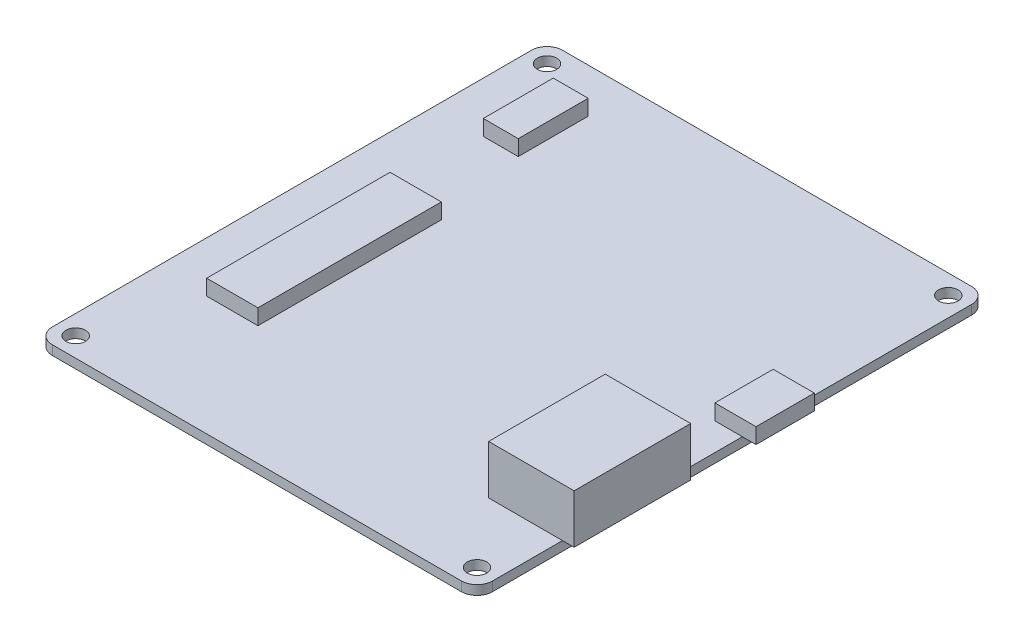
ISO-10303-21;
HEADER;
FILE_DESCRIPTION(('STEP AP214'),'2;1');
FILE_NAME('part.step','',(''),(''),'','','');
FILE_SCHEMA(('AUTOMOTIVE_DESIGN { 1 0 10303 214 1 1 1 1 }'));
ENDSEC;
DATA;
#1=APPLICATION_CONTEXT('core data for automotive mechanical design processes');
#2=APPLICATION_PROTOCOL_DEFINITION('international standard','automotive_design',2000,#1);
#3=PRODUCT_CONTEXT('',#1,'mechanical');
#4=PRODUCT('Part','Part','',(#3));
#5=PRODUCT_RELATED_PRODUCT_CATEGORY('part','',(#4));
#6=PRODUCT_DEFINITION_FORMATION('','',#4);
#7=PRODUCT_DEFINITION_CONTEXT('part definition',#1,'design');
#8=PRODUCT_DEFINITION('design','',#6,#7);
#9=PRODUCT_DEFINITION_SHAPE('','',#8);
#10=(LENGTH_UNIT() NAMED_UNIT(*) SI_UNIT(.MILLI.,.METRE.));
#11=(NAMED_UNIT(*) PLANE_ANGLE_UNIT() SI_UNIT($,.RADIAN.));
#12=(NAMED_UNIT(*) SI_UNIT($,.STERADIAN.) SOLID_ANGLE_UNIT());
#13=UNCERTAINTY_MEASURE_WITH_UNIT(LENGTH_MEASURE(1.E-05),#10,'distance_accuracy_value','');
#14=(GEOMETRIC_REPRESENTATION_CONTEXT(3) GLOBAL_UNCERTAINTY_ASSIGNED_CONTEXT((#13)) GLOBAL_UNIT_ASSIGNED_CONTEXT((#10,
#11,#12)) REPRESENTATION_CONTEXT('',''));
#15=CARTESIAN_POINT('',(0.,0.,0.));
#16=DIRECTION('',(0.,0.,1.));
#17=DIRECTION('',(1.,0.,0.));
#18=AXIS2_PLACEMENT_3D('',#15,#16,#17);
#19=CARTESIAN_POINT('',(26.32,1.2,-30.825));
#20=DIRECTION('',(0.,-1.,0.));
#21=DIRECTION('',(0.,0.,-1.));
#22=AXIS2_PLACEMENT_3D('',#19,#20,#21);
#23=PLANE('',#22);
#24=DIRECTION('',(0.,0.,1.));
#25=VECTOR('',#24,1.);
#26=CARTESIAN_POINT('',(-21.82,1.2,-6.12500000000001));
#27=LINE('',#26,#25);
#28=CARTESIAN_POINT('',(-21.82,1.2,-6.12500000000001));
#29=VERTEX_POINT('',#28);
#30=CARTESIAN_POINT('',(-21.82,1.2,17.475));
#31=VERTEX_POINT('',#30);
#32=EDGE_CURVE('E300',#29,#31,#27,.T.);
#33=ORIENTED_EDGE('',*,*,#32,.F.);
#34=DIRECTION('',(-1.,0.,0.));
#35=VECTOR('',#34,1.);
#36=CARTESIAN_POINT('',(-21.82,1.2,-6.12500000000001));
#37=LINE('',#36,#35);
#38=CARTESIAN_POINT('',(-15.22,1.2,-6.12500000000001));
#39=VERTEX_POINT('',#38);
#40=EDGE_CURVE('E305',#39,#29,#37,.T.);
#41=ORIENTED_EDGE('',*,*,#40,.F.);
#42=DIRECTION('',(0.,0.,-1.));
#43=VECTOR('',#42,1.);
#44=CARTESIAN_POINT('',(-15.22,1.2,-6.12500000000001));
#45=LINE('',#44,#43);
#46=CARTESIAN_POINT('',(-15.22,1.2,17.475));
#47=VERTEX_POINT('',#46);
#48=EDGE_CURVE('E317',#47,#39,#45,.T.);
#49=ORIENTED_EDGE('',*,*,#48,.F.);
#50=DIRECTION('',(1.,0.,0.));
#51=VECTOR('',#50,1.);
#52=CARTESIAN_POINT('',(-21.82,1.2,17.475));
#53=LINE('',#52,#51);
#54=EDGE_CURVE('E314',#31,#47,#53,.T.);
#55=ORIENTED_EDGE('',*,*,#54,.F.);
#56=EDGE_LOOP('',(#33,#41,#49,#55));
#57=FACE_BOUND('',#56,.T.);
#58=CARTESIAN_POINT('',(-25.82,1.2,-30.325));
#59=DIRECTION('',(0.,1.,0.));
#60=DIRECTION('',(0.,0.,1.));
#61=AXIS2_PLACEMENT_3D('',#58,#59,#60);
#62=CIRCLE('',#61,1.25);
#63=CARTESIAN_POINT('',(-25.82,1.2,-29.075));
#64=VERTEX_POINT('',#63);
#65=EDGE_CURVE('E333',#64,#64,#62,.T.);
#66=ORIENTED_EDGE('',*,*,#65,.F.);
#67=EDGE_LOOP('',(#66));
#68=FACE_BOUND('',#67,.T.);
#69=CARTESIAN_POINT('',(-25.82,1.2,30.325));
#70=DIRECTION('',(0.,1.,0.));
#71=DIRECTION('',(0.,0.,1.));
#72=AXIS2_PLACEMENT_3D('',#69,#70,#71);
#73=CIRCLE('',#72,1.25);
#74=CARTESIAN_POINT('',(-25.82,1.2,31.575));
#75=VERTEX_POINT('',#74);
#76=EDGE_CURVE('E339',#75,#75,#73,.T.);
#77=ORIENTED_EDGE('',*,*,#76,.F.);
#78=EDGE_LOOP('',(#77));
#79=FACE_BOUND('',#78,.T.);
#80=CARTESIAN_POINT('',(25.82,1.2,30.325));
#81=DIRECTION('',(0.,1.,0.));
#82=DIRECTION('',(0.,0.,1.));
#83=AXIS2_PLACEMENT_3D('',#80,#81,#82);
#84=CIRCLE('',#83,1.25);
#85=CARTESIAN_POINT('',(25.82,1.2,31.575));
#86=VERTEX_POINT('',#85);
#87=EDGE_CURVE('E345',#86,#86,#84,.T.);
#88=ORIENTED_EDGE('',*,*,#87,.F.);
#89=EDGE_LOOP('',(#88));
#90=FACE_BOUND('',#89,.T.);
#91=CARTESIAN_POINT('',(25.82,1.2,-30.325));
#92=DIRECTION('',(0.,1.,0.));
#93=DIRECTION('',(0.,0.,1.));
#94=AXIS2_PLACEMENT_3D('',#91,#92,#93);
#95=CIRCLE('',#94,1.25);
#96=CARTESIAN_POINT('',(25.82,1.2,-29.075));
#97=VERTEX_POINT('',#96);
#98=EDGE_CURVE('E351',#97,#97,#95,.T.);
#99=ORIENTED_EDGE('',*,*,#98,.F.);
#100=EDGE_LOOP('',(#99));
#101=FACE_BOUND('',#100,.T.);
#102=DIRECTION('',(0.,0.,1.));
#103=VECTOR('',#102,1.);
#104=CARTESIAN_POINT('',(-21.82,1.2,-27.125));
#105=LINE('',#104,#103);
#106=CARTESIAN_POINT('',(-21.82,1.2,-27.125));
#107=VERTEX_POINT('',#106);
#108=CARTESIAN_POINT('',(-21.82,1.2,-18.125));
#109=VERTEX_POINT('',#108);
#110=EDGE_CURVE('E267',#107,#109,#105,.T.);
#111=ORIENTED_EDGE('',*,*,#110,.F.);
#112=DIRECTION('',(-1.,0.,0.));
#113=VECTOR('',#112,1.);
#114=CARTESIAN_POINT('',(-21.82,1.2,-27.125));
#115=LINE('',#114,#113);
#116=CARTESIAN_POINT('',(-17.32,1.2,-27.125));
#117=VERTEX_POINT('',#116);
#118=EDGE_CURVE('E272',#117,#107,#115,.T.);
#119=ORIENTED_EDGE('',*,*,#118,.F.);
#120=DIRECTION('',(0.,0.,-1.));
#121=VECTOR('',#120,1.);
#122=CARTESIAN_POINT('',(-17.32,1.2,-27.125));
#123=LINE('',#122,#121);
#124=CARTESIAN_POINT('',(-17.32,1.2,-18.125));
#125=VERTEX_POINT('',#124);
#126=EDGE_CURVE('E284',#125,#117,#123,.T.);
#127=ORIENTED_EDGE('',*,*,#126,.F.);
#128=DIRECTION('',(1.,0.,0.));
#129=VECTOR('',#128,1.);
#130=CARTESIAN_POINT('',(-21.82,1.2,-18.125));
#131=LINE('',#130,#129);
#132=EDGE_CURVE('E281',#109,#125,#131,.T.);
#133=ORIENTED_EDGE('',*,*,#132,.F.);
#134=EDGE_LOOP('',(#111,#119,#127,#133));
#135=FACE_BOUND('',#134,.T.);
#136=DIRECTION('',(1.,0.,0.));
#137=VECTOR('',#136,1.);
#138=CARTESIAN_POINT('',(18.82,1.2,21.825));
#139=LINE('',#138,#137);
#140=CARTESIAN_POINT('',(18.82,1.2,21.825));
#141=VERTEX_POINT('',#140);
#142=CARTESIAN_POINT('',(28.32,1.2,21.825));
#143=VERTEX_POINT('',#142);
#144=EDGE_CURVE('E48',#141,#143,#139,.T.);
#145=ORIENTED_EDGE('',*,*,#144,.F.);
#146=DIRECTION('',(0.,0.,1.));
#147=VECTOR('',#146,1.);
#148=CARTESIAN_POINT('',(18.82,1.2,6.82499999999999));
#149=LINE('',#148,#147);
#150=CARTESIAN_POINT('',(18.82,1.2,6.825));
#151=VERTEX_POINT('',#150);
#152=EDGE_CURVE('E53',#151,#141,#149,.T.);
#153=ORIENTED_EDGE('',*,*,#152,.F.);
#154=DIRECTION('',(-1.,0.,0.));
#155=VECTOR('',#154,1.);
#156=CARTESIAN_POINT('',(18.82,1.2,6.82499999999999));
#157=LINE('',#156,#155);
#158=CARTESIAN_POINT('',(28.32,1.2,6.82499999999999));
#159=VERTEX_POINT('',#158);
#160=EDGE_CURVE('E839',#159,#151,#157,.T.);
#161=ORIENTED_EDGE('',*,*,#160,.F.);
#162=DIRECTION('',(0.,0.,-1.));
#163=VECTOR('',#162,1.);
#164=CARTESIAN_POINT('',(28.32,1.2,30.825));
#165=LINE('',#164,#163);
#166=CARTESIAN_POINT('',(28.32,1.2,-1.32500000000001));
#167=VERTEX_POINT('',#166);
#168=EDGE_CURVE('E379',#159,#167,#165,.T.);
#169=ORIENTED_EDGE('',*,*,#168,.T.);
#170=DIRECTION('',(1.,0.,0.));
#171=VECTOR('',#170,1.);
#172=CARTESIAN_POINT('',(24.78,1.2,-1.32500000000001));
#173=LINE('',#172,#171);
#174=CARTESIAN_POINT('',(24.78,1.2,-1.32500000000001));
#175=VERTEX_POINT('',#174);
#176=EDGE_CURVE('E248',#175,#167,#173,.T.);
#177=ORIENTED_EDGE('',*,*,#176,.F.);
#178=DIRECTION('',(0.,0.,1.));
#179=VECTOR('',#178,1.);
#180=CARTESIAN_POINT('',(24.78,1.2,-8.82500000000001));
#181=LINE('',#180,#179);
#182=CARTESIAN_POINT('',(24.78,1.2,-8.82500000000001));
#183=VERTEX_POINT('',#182);
#184=EDGE_CURVE('E228',#183,#175,#181,.T.);
#185=ORIENTED_EDGE('',*,*,#184,.F.);
#186=DIRECTION('',(-1.,0.,0.));
#187=VECTOR('',#186,1.);
#188=CARTESIAN_POINT('',(24.78,1.2,-8.82500000000001));
#189=LINE('',#188,#187);
#190=CARTESIAN_POINT('',(28.32,1.2,-8.82500000000001));
#191=VERTEX_POINT('',#190);
#192=EDGE_CURVE('E253',#191,#183,#189,.T.);
#193=ORIENTED_EDGE('',*,*,#192,.F.);
#194=CARTESIAN_POINT('',(28.32,1.2,-30.825));
#195=VERTEX_POINT('',#194);
#196=EDGE_CURVE('E374',#191,#195,#165,.T.);
#197=ORIENTED_EDGE('',*,*,#196,.T.);
#198=CARTESIAN_POINT('',(26.32,1.2,-30.825));
#199=DIRECTION('',(0.,1.,0.));
#200=DIRECTION('',(0.,0.,-1.));
#201=AXIS2_PLACEMENT_3D('',#198,#199,#200);
#202=CIRCLE('',#201,2.);
#203=CARTESIAN_POINT('',(26.32,1.2,-32.825));
#204=VERTEX_POINT('',#203);
#205=EDGE_CURVE('E358',#195,#204,#202,.T.);
#206=ORIENTED_EDGE('',*,*,#205,.T.);
#207=DIRECTION('',(-1.,0.,0.));
#208=VECTOR('',#207,1.);
#209=CARTESIAN_POINT('',(-26.32,1.2,-32.825));
#210=LINE('',#209,#208);
#211=CARTESIAN_POINT('',(-26.32,1.2,-32.825));
#212=VERTEX_POINT('',#211);
#213=EDGE_CURVE('E361',#204,#212,#210,.T.);
#214=ORIENTED_EDGE('',*,*,#213,.T.);
#215=CARTESIAN_POINT('',(-26.32,1.2,-30.825));
#216=DIRECTION('',(0.,1.,0.));
#217=DIRECTION('',(0.,0.,-1.));
#218=AXIS2_PLACEMENT_3D('',#215,#216,#217);
#219=CIRCLE('',#218,2.);
#220=CARTESIAN_POINT('',(-28.32,1.2,-30.825));
#221=VERTEX_POINT('',#220);
#222=EDGE_CURVE('E364',#212,#221,#219,.T.);
#223=ORIENTED_EDGE('',*,*,#222,.T.);
#224=DIRECTION('',(0.,0.,1.));
#225=VECTOR('',#224,1.);
#226=CARTESIAN_POINT('',(-28.32,1.2,30.825));
#227=LINE('',#226,#225);
#228=CARTESIAN_POINT('',(-28.32,1.2,30.825));
#229=VERTEX_POINT('',#228);
#230=EDGE_CURVE('E366',#221,#229,#227,.T.);
#231=ORIENTED_EDGE('',*,*,#230,.T.);
#232=CARTESIAN_POINT('',(-26.32,1.2,30.825));
#233=DIRECTION('',(0.,1.,0.));
#234=DIRECTION('',(0.,0.,-1.));
#235=AXIS2_PLACEMENT_3D('',#232,#233,#234);
#236=CIRCLE('',#235,2.);
#237=CARTESIAN_POINT('',(-26.32,1.2,32.825));
#238=VERTEX_POINT('',#237);
#239=EDGE_CURVE('E368',#229,#238,#236,.T.);
#240=ORIENTED_EDGE('',*,*,#239,.T.);
#241=DIRECTION('',(1.,0.,0.));
#242=VECTOR('',#241,1.);
#243=CARTESIAN_POINT('',(-26.32,1.2,32.825));
#244=LINE('',#243,#242);
#245=CARTESIAN_POINT('',(26.32,1.2,32.825));
#246=VERTEX_POINT('',#245);
#247=EDGE_CURVE('E370',#238,#246,#244,.T.);
#248=ORIENTED_EDGE('',*,*,#247,.T.);
#249=CARTESIAN_POINT('',(26.32,1.2,30.825));
#250=DIRECTION('',(0.,1.,0.));
#251=DIRECTION('',(0.,0.,1.));
#252=AXIS2_PLACEMENT_3D('',#249,#250,#251);
#253=CIRCLE('',#252,2.);
#254=CARTESIAN_POINT('',(28.32,1.2,30.825));
#255=VERTEX_POINT('',#254);
#256=EDGE_CURVE('E372',#246,#255,#253,.T.);
#257=ORIENTED_EDGE('',*,*,#256,.T.);
#258=EDGE_CURVE('E375',#255,#143,#165,.T.);
#259=ORIENTED_EDGE('',*,*,#258,.T.);
#260=EDGE_LOOP('',(#145,#153,#161,#169,#177,#185,#193,#197,#206,#214,#223,#231,#240,#248,#257,#259));
#261=FACE_BOUND('',#260,.T.);
#262=ADVANCED_FACE('F33',(#57,#68,#79,#90,#101,#135,#261),#23,.F.);
#263=CARTESIAN_POINT('',(26.32,1.2,-30.825));
#264=DIRECTION('',(0.,-1.,0.));
#265=DIRECTION('',(0.,0.,-1.));
#266=AXIS2_PLACEMENT_3D('',#263,#264,#265);
#267=CYLINDRICAL_SURFACE('',#266,2.);
#268=CARTESIAN_POINT('',(26.32,0.,-30.825));
#269=DIRECTION('',(0.,1.,0.));
#270=DIRECTION('',(0.,0.,-1.));
#271=AXIS2_PLACEMENT_3D('',#268,#269,#270);
#272=CIRCLE('',#271,2.);
#273=CARTESIAN_POINT('',(28.32,0.,-30.825));
#274=VERTEX_POINT('',#273);
#275=CARTESIAN_POINT('',(26.32,0.,-32.825));
#276=VERTEX_POINT('',#275);
#277=EDGE_CURVE('E357',#274,#276,#272,.T.);
#278=ORIENTED_EDGE('',*,*,#277,.T.);
#279=DIRECTION('',(0.,-1.,0.));
#280=VECTOR('',#279,1.);
#281=CARTESIAN_POINT('',(26.32,1.2,-32.825));
#282=LINE('',#281,#280);
#283=EDGE_CURVE('E11',#204,#276,#282,.T.);
#284=ORIENTED_EDGE('',*,*,#283,.F.);
#285=ORIENTED_EDGE('',*,*,#205,.F.);
#286=DIRECTION('',(0.,-1.,0.));
#287=VECTOR('',#286,1.);
#288=CARTESIAN_POINT('',(28.32,1.2,-30.825));
#289=LINE('',#288,#287);
#290=EDGE_CURVE('E377',#195,#274,#289,.T.);
#291=ORIENTED_EDGE('',*,*,#290,.T.);
#292=EDGE_LOOP('',(#278,#284,#285,#291));
#293=FACE_BOUND('',#292,.T.);
#294=ADVANCED_FACE('F35',(#293),#267,.T.);
#295=CARTESIAN_POINT('',(-26.32,1.2,-32.825));
#296=DIRECTION('',(0.,0.,1.));
#297=DIRECTION('',(1.,0.,0.));
#298=AXIS2_PLACEMENT_3D('',#295,#296,#297);
#299=PLANE('',#298);
#300=DIRECTION('',(-1.,0.,0.));
#301=VECTOR('',#300,1.);
#302=CARTESIAN_POINT('',(-26.32,0.,-32.825));
#303=LINE('',#302,#301);
#304=CARTESIAN_POINT('',(-26.32,0.,-32.825));
#305=VERTEX_POINT('',#304);
#306=EDGE_CURVE('E383',#276,#305,#303,.T.);
#307=ORIENTED_EDGE('',*,*,#306,.T.);
#308=DIRECTION('',(0.,-1.,0.));
#309=VECTOR('',#308,1.);
#310=CARTESIAN_POINT('',(-26.32,1.2,-32.825));
#311=LINE('',#310,#309);
#312=EDGE_CURVE('E41',#212,#305,#311,.T.);
#313=ORIENTED_EDGE('',*,*,#312,.F.);
#314=ORIENTED_EDGE('',*,*,#213,.F.);
#315=ORIENTED_EDGE('',*,*,#283,.T.);
#316=EDGE_LOOP('',(#307,#313,#314,#315));
#317=FACE_BOUND('',#316,.T.);
#318=ADVANCED_FACE('F438',(#317),#299,.F.);
#319=CARTESIAN_POINT('',(-26.32,1.2,-30.825));
#320=DIRECTION('',(0.,-1.,0.));
#321=DIRECTION('',(0.,0.,-1.));
#322=AXIS2_PLACEMENT_3D('',#319,#320,#321);
#323=CYLINDRICAL_SURFACE('',#322,2.);
#324=CARTESIAN_POINT('',(-26.32,0.,-30.825));
#325=DIRECTION('',(0.,1.,0.));
#326=DIRECTION('',(0.,0.,-1.));
#327=AXIS2_PLACEMENT_3D('',#324,#325,#326);
#328=CIRCLE('',#327,2.);
#329=CARTESIAN_POINT('',(-28.32,0.,-30.825));
#330=VERTEX_POINT('',#329);
#331=EDGE_CURVE('E385',#305,#330,#328,.T.);
#332=ORIENTED_EDGE('',*,*,#331,.T.);
#333=DIRECTION('',(0.,-1.,0.));
#334=VECTOR('',#333,1.);
#335=CARTESIAN_POINT('',(-28.32,1.2,-30.825));
#336=LINE('',#335,#334);
#337=EDGE_CURVE('E410',#221,#330,#336,.T.);
#338=ORIENTED_EDGE('',*,*,#337,.F.);
#339=ORIENTED_EDGE('',*,*,#222,.F.);
#340=ORIENTED_EDGE('',*,*,#312,.T.);
#341=EDGE_LOOP('',(#332,#338,#339,#340));
#342=FACE_BOUND('',#341,.T.);
#343=ADVANCED_FACE('F417',(#342),#323,.T.);
#344=CARTESIAN_POINT('',(-28.32,1.2,30.825));
#345=DIRECTION('',(1.,0.,0.));
#346=DIRECTION('',(0.,0.,-1.));
#347=AXIS2_PLACEMENT_3D('',#344,#345,#346);
#348=PLANE('',#347);
#349=DIRECTION('',(0.,0.,1.));
#350=VECTOR('',#349,1.);
#351=CARTESIAN_POINT('',(-28.32,0.,30.825));
#352=LINE('',#351,#350);
#353=CARTESIAN_POINT('',(-28.32,0.,30.825));
#354=VERTEX_POINT('',#353);
#355=EDGE_CURVE('E387',#330,#354,#352,.T.);
#356=ORIENTED_EDGE('',*,*,#355,.T.);
#357=DIRECTION('',(0.,-1.,0.));
#358=VECTOR('',#357,1.);
#359=CARTESIAN_POINT('',(-28.32,1.2,30.825));
#360=LINE('',#359,#358);
#361=EDGE_CURVE('E407',#229,#354,#360,.T.);
#362=ORIENTED_EDGE('',*,*,#361,.F.);
#363=ORIENTED_EDGE('',*,*,#230,.F.);
#364=ORIENTED_EDGE('',*,*,#337,.T.);
#365=EDGE_LOOP('',(#356,#362,#363,#364));
#366=FACE_BOUND('',#365,.T.);
#367=ADVANCED_FACE('F428',(#366),#348,.F.);
#368=CARTESIAN_POINT('',(-26.32,1.2,30.825));
#369=DIRECTION('',(0.,-1.,0.));
#370=DIRECTION('',(0.,0.,-1.));
#371=AXIS2_PLACEMENT_3D('',#368,#369,#370);
#372=CYLINDRICAL_SURFACE('',#371,2.);
#373=CARTESIAN_POINT('',(-26.32,0.,30.825));
#374=DIRECTION('',(0.,1.,0.));
#375=DIRECTION('',(0.,0.,-1.));
#376=AXIS2_PLACEMENT_3D('',#373,#374,#375);
#377=CIRCLE('',#376,2.);
#378=CARTESIAN_POINT('',(-26.32,0.,32.825));
#379=VERTEX_POINT('',#378);
#380=EDGE_CURVE('E389',#354,#379,#377,.T.);
#381=ORIENTED_EDGE('',*,*,#380,.T.);
#382=DIRECTION('',(0.,-1.,0.));
#383=VECTOR('',#382,1.);
#384=CARTESIAN_POINT('',(-26.32,1.2,32.825));
#385=LINE('',#384,#383);
#386=EDGE_CURVE('E404',#238,#379,#385,.T.);
#387=ORIENTED_EDGE('',*,*,#386,.F.);
#388=ORIENTED_EDGE('',*,*,#239,.F.);
#389=ORIENTED_EDGE('',*,*,#361,.T.);
#390=EDGE_LOOP('',(#381,#387,#388,#389));
#391=FACE_BOUND('',#390,.T.);
#392=ADVANCED_FACE('F432',(#391),#372,.T.);
#393=CARTESIAN_POINT('',(-26.32,1.2,32.825));
#394=DIRECTION('',(0.,0.,-1.));
#395=DIRECTION('',(-1.,0.,0.));
#396=AXIS2_PLACEMENT_3D('',#393,#394,#395);
#397=PLANE('',#396);
#398=DIRECTION('',(1.,0.,0.));
#399=VECTOR('',#398,1.);
#400=CARTESIAN_POINT('',(-26.32,0.,32.825));
#401=LINE('',#400,#399);
#402=CARTESIAN_POINT('',(26.32,0.,32.825));
#403=VERTEX_POINT('',#402);
#404=EDGE_CURVE('E391',#379,#403,#401,.T.);
#405=ORIENTED_EDGE('',*,*,#404,.T.);
#406=DIRECTION('',(0.,-1.,0.));
#407=VECTOR('',#406,1.);
#408=CARTESIAN_POINT('',(26.32,1.2,32.825));
#409=LINE('',#408,#407);
#410=EDGE_CURVE('E401',#246,#403,#409,.T.);
#411=ORIENTED_EDGE('',*,*,#410,.F.);
#412=ORIENTED_EDGE('',*,*,#247,.F.);
#413=ORIENTED_EDGE('',*,*,#386,.T.);
#414=EDGE_LOOP('',(#405,#411,#412,#413));
#415=FACE_BOUND('',#414,.T.);
#416=ADVANCED_FACE('F451',(#415),#397,.F.);
#417=CARTESIAN_POINT('',(26.32,1.2,30.825));
#418=DIRECTION('',(0.,-1.,0.));
#419=DIRECTION('',(0.,0.,-1.));
#420=AXIS2_PLACEMENT_3D('',#417,#418,#419);
#421=CYLINDRICAL_SURFACE('',#420,2.);
#422=CARTESIAN_POINT('',(26.32,0.,30.825));
#423=DIRECTION('',(0.,1.,0.));
#424=DIRECTION('',(0.,0.,1.));
#425=AXIS2_PLACEMENT_3D('',#422,#423,#424);
#426=CIRCLE('',#425,2.);
#427=CARTESIAN_POINT('',(28.32,0.,30.825));
#428=VERTEX_POINT('',#427);
#429=EDGE_CURVE('E393',#403,#428,#426,.T.);
#430=ORIENTED_EDGE('',*,*,#429,.T.);
#431=DIRECTION('',(0.,-1.,0.));
#432=VECTOR('',#431,1.);
#433=CARTESIAN_POINT('',(28.32,1.2,30.825));
#434=LINE('',#433,#432);
#435=EDGE_CURVE('E398',#255,#428,#434,.T.);
#436=ORIENTED_EDGE('',*,*,#435,.F.);
#437=ORIENTED_EDGE('',*,*,#256,.F.);
#438=ORIENTED_EDGE('',*,*,#410,.T.);
#439=EDGE_LOOP('',(#430,#436,#437,#438));
#440=FACE_BOUND('',#439,.T.);
#441=ADVANCED_FACE('F449',(#440),#421,.T.);
#442=CARTESIAN_POINT('',(28.32,1.2,30.825));
#443=DIRECTION('',(-1.,0.,0.));
#444=DIRECTION('',(0.,0.,1.));
#445=AXIS2_PLACEMENT_3D('',#442,#443,#444);
#446=PLANE('',#445);
#447=DIRECTION('',(0.,0.,-1.));
#448=VECTOR('',#447,1.);
#449=CARTESIAN_POINT('',(28.32,0.,30.825));
#450=LINE('',#449,#448);
#451=EDGE_CURVE('E362',#428,#274,#450,.T.);
#452=ORIENTED_EDGE('',*,*,#451,.T.);
#453=ORIENTED_EDGE('',*,*,#290,.F.);
#454=ORIENTED_EDGE('',*,*,#196,.F.);
#455=EDGE_CURVE('E380',#167,#191,#165,.T.);
#456=ORIENTED_EDGE('',*,*,#455,.F.);
#457=ORIENTED_EDGE('',*,*,#168,.F.);
#458=EDGE_CURVE('E378',#143,#159,#165,.T.);
#459=ORIENTED_EDGE('',*,*,#458,.F.);
#460=ORIENTED_EDGE('',*,*,#258,.F.);
#461=ORIENTED_EDGE('',*,*,#435,.T.);
#462=EDGE_LOOP('',(#452,#453,#454,#456,#457,#459,#460,#461));
#463=FACE_BOUND('',#462,.T.);
#464=ADVANCED_FACE('F444',(#463),#446,.F.);
#465=CARTESIAN_POINT('',(26.32,0.,-30.825));
#466=DIRECTION('',(0.,-1.,0.));
#467=DIRECTION('',(0.,0.,-1.));
#468=AXIS2_PLACEMENT_3D('',#465,#466,#467);
#469=PLANE('',#468);
#470=CARTESIAN_POINT('',(-25.82,0.,-30.325));
#471=DIRECTION('',(0.,1.,0.));
#472=DIRECTION('',(0.,0.,1.));
#473=AXIS2_PLACEMENT_3D('',#470,#471,#472);
#474=CIRCLE('',#473,1.25);
#475=CARTESIAN_POINT('',(-25.82,0.,-29.075));
#476=VERTEX_POINT('',#475);
#477=EDGE_CURVE('E336',#476,#476,#474,.T.);
#478=ORIENTED_EDGE('',*,*,#477,.T.);
#479=EDGE_LOOP('',(#478));
#480=FACE_BOUND('',#479,.T.);
#481=CARTESIAN_POINT('',(-25.82,0.,30.325));
#482=DIRECTION('',(0.,1.,0.));
#483=DIRECTION('',(0.,0.,1.));
#484=AXIS2_PLACEMENT_3D('',#481,#482,#483);
#485=CIRCLE('',#484,1.25);
#486=CARTESIAN_POINT('',(-25.82,0.,31.575));
#487=VERTEX_POINT('',#486);
#488=EDGE_CURVE('E342',#487,#487,#485,.T.);
#489=ORIENTED_EDGE('',*,*,#488,.T.);
#490=EDGE_LOOP('',(#489));
#491=FACE_BOUND('',#490,.T.);
#492=CARTESIAN_POINT('',(25.82,0.,30.325));
#493=DIRECTION('',(0.,1.,0.));
#494=DIRECTION('',(0.,0.,1.));
#495=AXIS2_PLACEMENT_3D('',#492,#493,#494);
#496=CIRCLE('',#495,1.25);
#497=CARTESIAN_POINT('',(25.82,0.,31.575));
#498=VERTEX_POINT('',#497);
#499=EDGE_CURVE('E348',#498,#498,#496,.T.);
#500=ORIENTED_EDGE('',*,*,#499,.T.);
#501=EDGE_LOOP('',(#500));
#502=FACE_BOUND('',#501,.T.);
#503=CARTESIAN_POINT('',(25.82,0.,-30.325));
#504=DIRECTION('',(0.,1.,0.));
#505=DIRECTION('',(0.,0.,1.));
#506=AXIS2_PLACEMENT_3D('',#503,#504,#505);
#507=CIRCLE('',#506,1.25);
#508=CARTESIAN_POINT('',(25.82,0.,-29.075));
#509=VERTEX_POINT('',#508);
#510=EDGE_CURVE('E354',#509,#509,#507,.T.);
#511=ORIENTED_EDGE('',*,*,#510,.T.);
#512=EDGE_LOOP('',(#511));
#513=FACE_BOUND('',#512,.T.);
#514=ORIENTED_EDGE('',*,*,#277,.F.);
#515=ORIENTED_EDGE('',*,*,#451,.F.);
#516=ORIENTED_EDGE('',*,*,#429,.F.);
#517=ORIENTED_EDGE('',*,*,#404,.F.);
#518=ORIENTED_EDGE('',*,*,#380,.F.);
#519=ORIENTED_EDGE('',*,*,#355,.F.);
#520=ORIENTED_EDGE('',*,*,#331,.F.);
#521=ORIENTED_EDGE('',*,*,#306,.F.);
#522=EDGE_LOOP('',(#514,#515,#516,#517,#518,#519,#520,#521));
#523=FACE_BOUND('',#522,.T.);
#524=ADVANCED_FACE('F423',(#480,#491,#502,#513,#523),#469,.T.);
#525=CARTESIAN_POINT('',(25.82,1.2,-30.325));
#526=DIRECTION('',(0.,1.,0.));
#527=DIRECTION('',(0.,0.,1.));
#528=AXIS2_PLACEMENT_3D('',#525,#526,#527);
#529=CYLINDRICAL_SURFACE('',#528,1.25);
#530=ORIENTED_EDGE('',*,*,#510,.F.);
#531=EDGE_LOOP('',(#530));
#532=FACE_BOUND('',#531,.T.);
#533=ORIENTED_EDGE('',*,*,#98,.T.);
#534=EDGE_LOOP('',(#533));
#535=FACE_BOUND('',#534,.T.);
#536=ADVANCED_FACE('F471',(#532,#535),#529,.F.);
#537=CARTESIAN_POINT('',(25.82,1.2,30.325));
#538=DIRECTION('',(0.,1.,0.));
#539=DIRECTION('',(0.,0.,1.));
#540=AXIS2_PLACEMENT_3D('',#537,#538,#539);
#541=CYLINDRICAL_SURFACE('',#540,1.25);
#542=ORIENTED_EDGE('',*,*,#499,.F.);
#543=EDGE_LOOP('',(#542));
#544=FACE_BOUND('',#543,.T.);
#545=ORIENTED_EDGE('',*,*,#87,.T.);
#546=EDGE_LOOP('',(#545));
#547=FACE_BOUND('',#546,.T.);
#548=ADVANCED_FACE('F606',(#544,#547),#541,.F.);
#549=CARTESIAN_POINT('',(-25.82,1.2,30.325));
#550=DIRECTION('',(0.,1.,0.));
#551=DIRECTION('',(0.,0.,1.));
#552=AXIS2_PLACEMENT_3D('',#549,#550,#551);
#553=CYLINDRICAL_SURFACE('',#552,1.25);
#554=ORIENTED_EDGE('',*,*,#488,.F.);
#555=EDGE_LOOP('',(#554));
#556=FACE_BOUND('',#555,.T.);
#557=ORIENTED_EDGE('',*,*,#76,.T.);
#558=EDGE_LOOP('',(#557));
#559=FACE_BOUND('',#558,.T.);
#560=ADVANCED_FACE('F603',(#556,#559),#553,.F.);
#561=CARTESIAN_POINT('',(-25.82,1.2,-30.325));
#562=DIRECTION('',(0.,1.,0.));
#563=DIRECTION('',(0.,0.,1.));
#564=AXIS2_PLACEMENT_3D('',#561,#562,#563);
#565=CYLINDRICAL_SURFACE('',#564,1.25);
#566=ORIENTED_EDGE('',*,*,#477,.F.);
#567=EDGE_LOOP('',(#566));
#568=FACE_BOUND('',#567,.T.);
#569=ORIENTED_EDGE('',*,*,#65,.T.);
#570=EDGE_LOOP('',(#569));
#571=FACE_BOUND('',#570,.T.);
#572=ADVANCED_FACE('F599',(#568,#571),#565,.F.);
#573=CARTESIAN_POINT('',(-21.82,3.2,-6.12500000000001));
#574=DIRECTION('',(1.,0.,0.));
#575=DIRECTION('',(0.,0.,-1.));
#576=AXIS2_PLACEMENT_3D('',#573,#574,#575);
#577=PLANE('',#576);
#578=ORIENTED_EDGE('',*,*,#32,.T.);
#579=DIRECTION('',(0.,-1.,0.));
#580=VECTOR('',#579,1.);
#581=CARTESIAN_POINT('',(-21.82,3.2,17.475));
#582=LINE('',#581,#580);
#583=CARTESIAN_POINT('',(-21.82,3.2,17.475));
#584=VERTEX_POINT('',#583);
#585=EDGE_CURVE('E330',#584,#31,#582,.T.);
#586=ORIENTED_EDGE('',*,*,#585,.F.);
#587=DIRECTION('',(0.,0.,1.));
#588=VECTOR('',#587,1.);
#589=CARTESIAN_POINT('',(-21.82,3.2,-6.12500000000001));
#590=LINE('',#589,#588);
#591=CARTESIAN_POINT('',(-21.82,3.2,-6.12500000000001));
#592=VERTEX_POINT('',#591);
#593=EDGE_CURVE('E301',#592,#584,#590,.T.);
#594=ORIENTED_EDGE('',*,*,#593,.F.);
#595=DIRECTION('',(0.,-1.,0.));
#596=VECTOR('',#595,1.);
#597=CARTESIAN_POINT('',(-21.82,3.2,-6.12500000000001));
#598=LINE('',#597,#596);
#599=EDGE_CURVE('E311',#592,#29,#598,.T.);
#600=ORIENTED_EDGE('',*,*,#599,.T.);
#601=EDGE_LOOP('',(#578,#586,#594,#600));
#602=FACE_BOUND('',#601,.T.);
#603=ADVANCED_FACE('F595',(#602),#577,.F.);
#604=CARTESIAN_POINT('',(-21.82,3.2,17.475));
#605=DIRECTION('',(0.,0.,-1.));
#606=DIRECTION('',(-1.,0.,0.));
#607=AXIS2_PLACEMENT_3D('',#604,#605,#606);
#608=PLANE('',#607);
#609=ORIENTED_EDGE('',*,*,#54,.T.);
#610=DIRECTION('',(0.,-1.,0.));
#611=VECTOR('',#610,1.);
#612=CARTESIAN_POINT('',(-15.22,3.2,17.475));
#613=LINE('',#612,#611);
#614=CARTESIAN_POINT('',(-15.22,3.2,17.475));
#615=VERTEX_POINT('',#614);
#616=EDGE_CURVE('E327',#615,#47,#613,.T.);
#617=ORIENTED_EDGE('',*,*,#616,.F.);
#618=DIRECTION('',(1.,0.,0.));
#619=VECTOR('',#618,1.);
#620=CARTESIAN_POINT('',(-21.82,3.2,17.475));
#621=LINE('',#620,#619);
#622=EDGE_CURVE('E304',#584,#615,#621,.T.);
#623=ORIENTED_EDGE('',*,*,#622,.F.);
#624=ORIENTED_EDGE('',*,*,#585,.T.);
#625=EDGE_LOOP('',(#609,#617,#623,#624));
#626=FACE_BOUND('',#625,.T.);
#627=ADVANCED_FACE('F591',(#626),#608,.F.);
#628=CARTESIAN_POINT('',(-15.22,3.2,-6.12500000000001));
#629=DIRECTION('',(-1.,0.,0.));
#630=DIRECTION('',(0.,0.,1.));
#631=AXIS2_PLACEMENT_3D('',#628,#629,#630);
#632=PLANE('',#631);
#633=ORIENTED_EDGE('',*,*,#48,.T.);
#634=DIRECTION('',(0.,-1.,0.));
#635=VECTOR('',#634,1.);
#636=CARTESIAN_POINT('',(-15.22,3.2,-6.12500000000001));
#637=LINE('',#636,#635);
#638=CARTESIAN_POINT('',(-15.22,3.2,-6.12500000000001));
#639=VERTEX_POINT('',#638);
#640=EDGE_CURVE('E324',#639,#39,#637,.T.);
#641=ORIENTED_EDGE('',*,*,#640,.F.);
#642=DIRECTION('',(0.,0.,-1.));
#643=VECTOR('',#642,1.);
#644=CARTESIAN_POINT('',(-15.22,3.2,-6.12500000000001));
#645=LINE('',#644,#643);
#646=EDGE_CURVE('E307',#615,#639,#645,.T.);
#647=ORIENTED_EDGE('',*,*,#646,.F.);
#648=ORIENTED_EDGE('',*,*,#616,.T.);
#649=EDGE_LOOP('',(#633,#641,#647,#648));
#650=FACE_BOUND('',#649,.T.);
#651=ADVANCED_FACE('F587',(#650),#632,.F.);
#652=CARTESIAN_POINT('',(-21.82,3.2,-6.12500000000001));
#653=DIRECTION('',(0.,0.,1.));
#654=DIRECTION('',(1.,0.,0.));
#655=AXIS2_PLACEMENT_3D('',#652,#653,#654);
#656=PLANE('',#655);
#657=ORIENTED_EDGE('',*,*,#40,.T.);
#658=ORIENTED_EDGE('',*,*,#599,.F.);
#659=DIRECTION('',(-1.,0.,0.));
#660=VECTOR('',#659,1.);
#661=CARTESIAN_POINT('',(-21.82,3.2,-6.12500000000001));
#662=LINE('',#661,#660);
#663=EDGE_CURVE('E309',#639,#592,#662,.T.);
#664=ORIENTED_EDGE('',*,*,#663,.F.);
#665=ORIENTED_EDGE('',*,*,#640,.T.);
#666=EDGE_LOOP('',(#657,#658,#664,#665));
#667=FACE_BOUND('',#666,.T.);
#668=ADVANCED_FACE('F583',(#667),#656,.F.);
#669=CARTESIAN_POINT('',(0.,3.2,0.));
#670=DIRECTION('',(0.,1.,0.));
#671=DIRECTION('',(0.,0.,1.));
#672=AXIS2_PLACEMENT_3D('',#669,#670,#671);
#673=PLANE('',#672);
#674=ORIENTED_EDGE('',*,*,#593,.T.);
#675=ORIENTED_EDGE('',*,*,#622,.T.);
#676=ORIENTED_EDGE('',*,*,#646,.T.);
#677=ORIENTED_EDGE('',*,*,#663,.T.);
#678=EDGE_LOOP('',(#674,#675,#676,#677));
#679=FACE_BOUND('',#678,.T.);
#680=ADVANCED_FACE('F579',(#679),#673,.T.);
#681=CARTESIAN_POINT('',(-21.82,3.2,-27.125));
#682=DIRECTION('',(1.,0.,0.));
#683=DIRECTION('',(0.,0.,-1.));
#684=AXIS2_PLACEMENT_3D('',#681,#682,#683);
#685=PLANE('',#684);
#686=ORIENTED_EDGE('',*,*,#110,.T.);
#687=DIRECTION('',(0.,-1.,0.));
#688=VECTOR('',#687,1.);
#689=CARTESIAN_POINT('',(-21.82,3.2,-18.125));
#690=LINE('',#689,#688);
#691=CARTESIAN_POINT('',(-21.82,3.2,-18.125));
#692=VERTEX_POINT('',#691);
#693=EDGE_CURVE('E297',#692,#109,#690,.T.);
#694=ORIENTED_EDGE('',*,*,#693,.F.);
#695=DIRECTION('',(0.,0.,1.));
#696=VECTOR('',#695,1.);
#697=CARTESIAN_POINT('',(-21.82,3.2,-27.125));
#698=LINE('',#697,#696);
#699=CARTESIAN_POINT('',(-21.82,3.2,-27.125));
#700=VERTEX_POINT('',#699);
#701=EDGE_CURVE('E268',#700,#692,#698,.T.);
#702=ORIENTED_EDGE('',*,*,#701,.F.);
#703=DIRECTION('',(0.,-1.,0.));
#704=VECTOR('',#703,1.);
#705=CARTESIAN_POINT('',(-21.82,3.2,-27.125));
#706=LINE('',#705,#704);
#707=EDGE_CURVE('E278',#700,#107,#706,.T.);
#708=ORIENTED_EDGE('',*,*,#707,.T.);
#709=EDGE_LOOP('',(#686,#694,#702,#708));
#710=FACE_BOUND('',#709,.T.);
#711=ADVANCED_FACE('F575',(#710),#685,.F.);
#712=CARTESIAN_POINT('',(-21.82,3.2,-18.125));
#713=DIRECTION('',(0.,0.,-1.));
#714=DIRECTION('',(-1.,0.,0.));
#715=AXIS2_PLACEMENT_3D('',#712,#713,#714);
#716=PLANE('',#715);
#717=ORIENTED_EDGE('',*,*,#132,.T.);
#718=DIRECTION('',(0.,-1.,0.));
#719=VECTOR('',#718,1.);
#720=CARTESIAN_POINT('',(-17.32,3.2,-18.125));
#721=LINE('',#720,#719);
#722=CARTESIAN_POINT('',(-17.32,3.2,-18.125));
#723=VERTEX_POINT('',#722);
#724=EDGE_CURVE('E294',#723,#125,#721,.T.);
#725=ORIENTED_EDGE('',*,*,#724,.F.);
#726=DIRECTION('',(1.,0.,0.));
#727=VECTOR('',#726,1.);
#728=CARTESIAN_POINT('',(-21.82,3.2,-18.125));
#729=LINE('',#728,#727);
#730=EDGE_CURVE('E271',#692,#723,#729,.T.);
#731=ORIENTED_EDGE('',*,*,#730,.F.);
#732=ORIENTED_EDGE('',*,*,#693,.T.);
#733=EDGE_LOOP('',(#717,#725,#731,#732));
#734=FACE_BOUND('',#733,.T.);
#735=ADVANCED_FACE('F571',(#734),#716,.F.);
#736=CARTESIAN_POINT('',(-17.32,3.2,-27.125));
#737=DIRECTION('',(-1.,0.,0.));
#738=DIRECTION('',(0.,0.,1.));
#739=AXIS2_PLACEMENT_3D('',#736,#737,#738);
#740=PLANE('',#739);
#741=ORIENTED_EDGE('',*,*,#126,.T.);
#742=DIRECTION('',(0.,-1.,0.));
#743=VECTOR('',#742,1.);
#744=CARTESIAN_POINT('',(-17.32,3.2,-27.125));
#745=LINE('',#744,#743);
#746=CARTESIAN_POINT('',(-17.32,3.2,-27.125));
#747=VERTEX_POINT('',#746);
#748=EDGE_CURVE('E291',#747,#117,#745,.T.);
#749=ORIENTED_EDGE('',*,*,#748,.F.);
#750=DIRECTION('',(0.,0.,-1.));
#751=VECTOR('',#750,1.);
#752=CARTESIAN_POINT('',(-17.32,3.2,-27.125));
#753=LINE('',#752,#751);
#754=EDGE_CURVE('E274',#723,#747,#753,.T.);
#755=ORIENTED_EDGE('',*,*,#754,.F.);
#756=ORIENTED_EDGE('',*,*,#724,.T.);
#757=EDGE_LOOP('',(#741,#749,#755,#756));
#758=FACE_BOUND('',#757,.T.);
#759=ADVANCED_FACE('F567',(#758),#740,.F.);
#760=CARTESIAN_POINT('',(-21.82,3.2,-27.125));
#761=DIRECTION('',(0.,0.,1.));
#762=DIRECTION('',(1.,0.,0.));
#763=AXIS2_PLACEMENT_3D('',#760,#761,#762);
#764=PLANE('',#763);
#765=ORIENTED_EDGE('',*,*,#118,.T.);
#766=ORIENTED_EDGE('',*,*,#707,.F.);
#767=DIRECTION('',(-1.,0.,0.));
#768=VECTOR('',#767,1.);
#769=CARTESIAN_POINT('',(-21.82,3.2,-27.125));
#770=LINE('',#769,#768);
#771=EDGE_CURVE('E276',#747,#700,#770,.T.);
#772=ORIENTED_EDGE('',*,*,#771,.F.);
#773=ORIENTED_EDGE('',*,*,#748,.T.);
#774=EDGE_LOOP('',(#765,#766,#772,#773));
#775=FACE_BOUND('',#774,.T.);
#776=ADVANCED_FACE('F563',(#775),#764,.F.);
#777=CARTESIAN_POINT('',(0.,3.2,0.));
#778=DIRECTION('',(0.,1.,0.));
#779=DIRECTION('',(0.,0.,1.));
#780=AXIS2_PLACEMENT_3D('',#777,#778,#779);
#781=PLANE('',#780);
#782=ORIENTED_EDGE('',*,*,#701,.T.);
#783=ORIENTED_EDGE('',*,*,#730,.T.);
#784=ORIENTED_EDGE('',*,*,#754,.T.);
#785=ORIENTED_EDGE('',*,*,#771,.T.);
#786=EDGE_LOOP('',(#782,#783,#784,#785));
#787=FACE_BOUND('',#786,.T.);
#788=ADVANCED_FACE('F545',(#787),#781,.T.);
#789=CARTESIAN_POINT('',(0.,1.2,0.));
#790=DIRECTION('',(0.,1.,0.));
#791=DIRECTION('',(0.,0.,1.));
#792=AXIS2_PLACEMENT_3D('',#789,#790,#791);
#793=PLANE('',#792);
#794=CARTESIAN_POINT('',(30.08,1.2,-1.32500000000001));
#795=VERTEX_POINT('',#794);
#796=EDGE_CURVE('E231',#167,#795,#173,.T.);
#797=ORIENTED_EDGE('',*,*,#796,.F.);
#798=ORIENTED_EDGE('',*,*,#455,.T.);
#799=CARTESIAN_POINT('',(30.08,1.2,-8.82500000000001));
#800=VERTEX_POINT('',#799);
#801=EDGE_CURVE('E241',#800,#191,#189,.T.);
#802=ORIENTED_EDGE('',*,*,#801,.F.);
#803=DIRECTION('',(0.,0.,-1.));
#804=VECTOR('',#803,1.);
#805=CARTESIAN_POINT('',(30.08,1.2,-8.82500000000001));
#806=LINE('',#805,#804);
#807=EDGE_CURVE('E251',#795,#800,#806,.T.);
#808=ORIENTED_EDGE('',*,*,#807,.F.);
#809=EDGE_LOOP('',(#797,#798,#802,#808));
#810=FACE_BOUND('',#809,.T.);
#811=ADVANCED_FACE('F541',(#810),#793,.F.);
#812=CARTESIAN_POINT('',(24.78,3.2,-8.82500000000001));
#813=DIRECTION('',(1.,0.,0.));
#814=DIRECTION('',(0.,0.,-1.));
#815=AXIS2_PLACEMENT_3D('',#812,#813,#814);
#816=PLANE('',#815);
#817=ORIENTED_EDGE('',*,*,#184,.T.);
#818=DIRECTION('',(0.,-1.,0.));
#819=VECTOR('',#818,1.);
#820=CARTESIAN_POINT('',(24.78,3.2,-1.32500000000001));
#821=LINE('',#820,#819);
#822=CARTESIAN_POINT('',(24.78,3.2,-1.32500000000001));
#823=VERTEX_POINT('',#822);
#824=EDGE_CURVE('E264',#823,#175,#821,.T.);
#825=ORIENTED_EDGE('',*,*,#824,.F.);
#826=DIRECTION('',(0.,0.,1.));
#827=VECTOR('',#826,1.);
#828=CARTESIAN_POINT('',(24.78,3.2,-8.82500000000001));
#829=LINE('',#828,#827);
#830=CARTESIAN_POINT('',(24.78,3.2,-8.82500000000001));
#831=VERTEX_POINT('',#830);
#832=EDGE_CURVE('E237',#831,#823,#829,.T.);
#833=ORIENTED_EDGE('',*,*,#832,.F.);
#834=DIRECTION('',(0.,-1.,0.));
#835=VECTOR('',#834,1.);
#836=CARTESIAN_POINT('',(24.78,3.2,-8.82500000000001));
#837=LINE('',#836,#835);
#838=EDGE_CURVE('E246',#831,#183,#837,.T.);
#839=ORIENTED_EDGE('',*,*,#838,.T.);
#840=EDGE_LOOP('',(#817,#825,#833,#839));
#841=FACE_BOUND('',#840,.T.);
#842=ADVANCED_FACE('F544',(#841),#816,.F.);
#843=CARTESIAN_POINT('',(24.78,3.2,-1.32500000000001));
#844=DIRECTION('',(0.,0.,-1.));
#845=DIRECTION('',(-1.,0.,0.));
#846=AXIS2_PLACEMENT_3D('',#843,#844,#845);
#847=PLANE('',#846);
#848=ORIENTED_EDGE('',*,*,#176,.T.);
#849=ORIENTED_EDGE('',*,*,#796,.T.);
#850=DIRECTION('',(0.,-1.,0.));
#851=VECTOR('',#850,1.);
#852=CARTESIAN_POINT('',(30.08,3.2,-1.32500000000001));
#853=LINE('',#852,#851);
#854=CARTESIAN_POINT('',(30.08,3.2,-1.32500000000001));
#855=VERTEX_POINT('',#854);
#856=EDGE_CURVE('E261',#855,#795,#853,.T.);
#857=ORIENTED_EDGE('',*,*,#856,.F.);
#858=DIRECTION('',(1.,0.,0.));
#859=VECTOR('',#858,1.);
#860=CARTESIAN_POINT('',(24.78,3.2,-1.32500000000001));
#861=LINE('',#860,#859);
#862=EDGE_CURVE('E240',#823,#855,#861,.T.);
#863=ORIENTED_EDGE('',*,*,#862,.F.);
#864=ORIENTED_EDGE('',*,*,#824,.T.);
#865=EDGE_LOOP('',(#848,#849,#857,#863,#864));
#866=FACE_BOUND('',#865,.T.);
#867=ADVANCED_FACE('F553',(#866),#847,.F.);
#868=CARTESIAN_POINT('',(30.08,3.2,-8.82500000000001));
#869=DIRECTION('',(-1.,0.,0.));
#870=DIRECTION('',(0.,0.,1.));
#871=AXIS2_PLACEMENT_3D('',#868,#869,#870);
#872=PLANE('',#871);
#873=ORIENTED_EDGE('',*,*,#807,.T.);
#874=DIRECTION('',(0.,-1.,0.));
#875=VECTOR('',#874,1.);
#876=CARTESIAN_POINT('',(30.08,3.2,-8.82500000000001));
#877=LINE('',#876,#875);
#878=CARTESIAN_POINT('',(30.08,3.2,-8.82500000000001));
#879=VERTEX_POINT('',#878);
#880=EDGE_CURVE('E258',#879,#800,#877,.T.);
#881=ORIENTED_EDGE('',*,*,#880,.F.);
#882=DIRECTION('',(0.,0.,-1.));
#883=VECTOR('',#882,1.);
#884=CARTESIAN_POINT('',(30.08,3.2,-8.82500000000001));
#885=LINE('',#884,#883);
#886=EDGE_CURVE('E243',#855,#879,#885,.T.);
#887=ORIENTED_EDGE('',*,*,#886,.F.);
#888=ORIENTED_EDGE('',*,*,#856,.T.);
#889=EDGE_LOOP('',(#873,#881,#887,#888));
#890=FACE_BOUND('',#889,.T.);
#891=ADVANCED_FACE('F549',(#890),#872,.F.);
#892=CARTESIAN_POINT('',(24.78,3.2,-8.82500000000001));
#893=DIRECTION('',(0.,0.,1.));
#894=DIRECTION('',(1.,0.,0.));
#895=AXIS2_PLACEMENT_3D('',#892,#893,#894);
#896=PLANE('',#895);
#897=ORIENTED_EDGE('',*,*,#801,.T.);
#898=ORIENTED_EDGE('',*,*,#192,.T.);
#899=ORIENTED_EDGE('',*,*,#838,.F.);
#900=DIRECTION('',(-1.,0.,0.));
#901=VECTOR('',#900,1.);
#902=CARTESIAN_POINT('',(24.78,3.2,-8.82500000000001));
#903=LINE('',#902,#901);
#904=EDGE_CURVE('E245',#879,#831,#903,.T.);
#905=ORIENTED_EDGE('',*,*,#904,.F.);
#906=ORIENTED_EDGE('',*,*,#880,.T.);
#907=EDGE_LOOP('',(#897,#898,#899,#905,#906));
#908=FACE_BOUND('',#907,.T.);
#909=ADVANCED_FACE('F539',(#908),#896,.F.);
#910=CARTESIAN_POINT('',(0.,3.2,0.));
#911=DIRECTION('',(0.,1.,0.));
#912=DIRECTION('',(0.,0.,1.));
#913=AXIS2_PLACEMENT_3D('',#910,#911,#912);
#914=PLANE('',#913);
#915=ORIENTED_EDGE('',*,*,#832,.T.);
#916=ORIENTED_EDGE('',*,*,#862,.T.);
#917=ORIENTED_EDGE('',*,*,#886,.T.);
#918=ORIENTED_EDGE('',*,*,#904,.T.);
#919=EDGE_LOOP('',(#915,#916,#917,#918));
#920=FACE_BOUND('',#919,.T.);
#921=ADVANCED_FACE('F486',(#920),#914,.T.);
#922=CARTESIAN_POINT('',(0.,1.2,0.));
#923=DIRECTION('',(0.,1.,0.));
#924=DIRECTION('',(0.,0.,1.));
#925=AXIS2_PLACEMENT_3D('',#922,#923,#924);
#926=PLANE('',#925);
#927=CARTESIAN_POINT('',(29.82,1.2,21.825));
#928=VERTEX_POINT('',#927);
#929=EDGE_CURVE('E837',#143,#928,#139,.T.);
#930=ORIENTED_EDGE('',*,*,#929,.F.);
#931=ORIENTED_EDGE('',*,*,#458,.T.);
#932=CARTESIAN_POINT('',(29.82,1.2,6.82499999999999));
#933=VERTEX_POINT('',#932);
#934=EDGE_CURVE('E225',#933,#159,#157,.T.);
#935=ORIENTED_EDGE('',*,*,#934,.F.);
#936=DIRECTION('',(0.,0.,-1.));
#937=VECTOR('',#936,1.);
#938=CARTESIAN_POINT('',(29.82,1.2,6.82499999999999));
#939=LINE('',#938,#937);
#940=EDGE_CURVE('E842',#928,#933,#939,.T.);
#941=ORIENTED_EDGE('',*,*,#940,.F.);
#942=EDGE_LOOP('',(#930,#931,#935,#941));
#943=FACE_BOUND('',#942,.T.);
#944=ADVANCED_FACE('F481',(#943),#926,.F.);
#945=CARTESIAN_POINT('',(18.82,7.5,6.82499999999999));
#946=DIRECTION('',(1.,0.,0.));
#947=DIRECTION('',(0.,0.,-1.));
#948=AXIS2_PLACEMENT_3D('',#945,#946,#947);
#949=PLANE('',#948);
#950=ORIENTED_EDGE('',*,*,#152,.T.);
#951=DIRECTION('',(0.,-1.,0.));
#952=VECTOR('',#951,1.);
#953=CARTESIAN_POINT('',(18.82,7.5,21.825));
#954=LINE('',#953,#952);
#955=CARTESIAN_POINT('',(18.82,7.5,21.825));
#956=VERTEX_POINT('',#955);
#957=EDGE_CURVE('E210',#956,#141,#954,.T.);
#958=ORIENTED_EDGE('',*,*,#957,.F.);
#959=DIRECTION('',(0.,0.,1.));
#960=VECTOR('',#959,1.);
#961=CARTESIAN_POINT('',(18.82,7.5,6.82499999999999));
#962=LINE('',#961,#960);
#963=CARTESIAN_POINT('',(18.82,7.5,6.82499999999999));
#964=VERTEX_POINT('',#963);
#965=EDGE_CURVE('E216',#964,#956,#962,.T.);
#966=ORIENTED_EDGE('',*,*,#965,.F.);
#967=DIRECTION('',(0.,-1.,0.));
#968=VECTOR('',#967,1.);
#969=CARTESIAN_POINT('',(18.82,7.5,6.82499999999999));
#970=LINE('',#969,#968);
#971=EDGE_CURVE('E846',#964,#151,#970,.T.);
#972=ORIENTED_EDGE('',*,*,#971,.T.);
#973=EDGE_LOOP('',(#950,#958,#966,#972));
#974=FACE_BOUND('',#973,.T.);
#975=ADVANCED_FACE('F227',(#974),#949,.F.);
#976=CARTESIAN_POINT('',(18.82,7.5,21.825));
#977=DIRECTION('',(0.,0.,-1.));
#978=DIRECTION('',(-1.,0.,0.));
#979=AXIS2_PLACEMENT_3D('',#976,#977,#978);
#980=PLANE('',#979);
#981=ORIENTED_EDGE('',*,*,#144,.T.);
#982=ORIENTED_EDGE('',*,*,#929,.T.);
#983=DIRECTION('',(0.,-1.,0.));
#984=VECTOR('',#983,1.);
#985=CARTESIAN_POINT('',(29.82,7.5,21.825));
#986=LINE('',#985,#984);
#987=CARTESIAN_POINT('',(29.82,7.5,21.825));
#988=VERTEX_POINT('',#987);
#989=EDGE_CURVE('E212',#988,#928,#986,.T.);
#990=ORIENTED_EDGE('',*,*,#989,.F.);
#991=DIRECTION('',(1.,0.,0.));
#992=VECTOR('',#991,1.);
#993=CARTESIAN_POINT('',(18.82,7.5,21.825));
#994=LINE('',#993,#992);
#995=EDGE_CURVE('E206',#956,#988,#994,.T.);
#996=ORIENTED_EDGE('',*,*,#995,.F.);
#997=ORIENTED_EDGE('',*,*,#957,.T.);
#998=EDGE_LOOP('',(#981,#982,#990,#996,#997));
#999=FACE_BOUND('',#998,.T.);
#1000=ADVANCED_FACE('F208',(#999),#980,.F.);
#1001=CARTESIAN_POINT('',(29.82,7.5,6.82499999999999));
#1002=DIRECTION('',(-1.,0.,0.));
#1003=DIRECTION('',(0.,0.,1.));
#1004=AXIS2_PLACEMENT_3D('',#1001,#1002,#1003);
#1005=PLANE('',#1004);
#1006=ORIENTED_EDGE('',*,*,#940,.T.);
#1007=DIRECTION('',(0.,-1.,0.));
#1008=VECTOR('',#1007,1.);
#1009=CARTESIAN_POINT('',(29.82,7.5,6.82499999999999));
#1010=LINE('',#1009,#1008);
#1011=CARTESIAN_POINT('',(29.82,7.5,6.82499999999999));
#1012=VERTEX_POINT('',#1011);
#1013=EDGE_CURVE('E233',#1012,#933,#1010,.T.);
#1014=ORIENTED_EDGE('',*,*,#1013,.F.);
#1015=DIRECTION('',(0.,0.,-1.));
#1016=VECTOR('',#1015,1.);
#1017=CARTESIAN_POINT('',(29.82,7.5,6.82499999999999));
#1018=LINE('',#1017,#1016);
#1019=EDGE_CURVE('E215',#988,#1012,#1018,.T.);
#1020=ORIENTED_EDGE('',*,*,#1019,.F.);
#1021=ORIENTED_EDGE('',*,*,#989,.T.);
#1022=EDGE_LOOP('',(#1006,#1014,#1020,#1021));
#1023=FACE_BOUND('',#1022,.T.);
#1024=ADVANCED_FACE('F506',(#1023),#1005,.F.);
#1025=CARTESIAN_POINT('',(18.82,7.5,6.82499999999999));
#1026=DIRECTION('',(0.,0.,1.));
#1027=DIRECTION('',(1.,0.,0.));
#1028=AXIS2_PLACEMENT_3D('',#1025,#1026,#1027);
#1029=PLANE('',#1028);
#1030=ORIENTED_EDGE('',*,*,#934,.T.);
#1031=ORIENTED_EDGE('',*,*,#160,.T.);
#1032=ORIENTED_EDGE('',*,*,#971,.F.);
#1033=DIRECTION('',(-1.,0.,0.));
#1034=VECTOR('',#1033,1.);
#1035=CARTESIAN_POINT('',(18.82,7.5,6.82499999999999));
#1036=LINE('',#1035,#1034);
#1037=EDGE_CURVE('E221',#1012,#964,#1036,.T.);
#1038=ORIENTED_EDGE('',*,*,#1037,.F.);
#1039=ORIENTED_EDGE('',*,*,#1013,.T.);
#1040=EDGE_LOOP('',(#1030,#1031,#1032,#1038,#1039));
#1041=FACE_BOUND('',#1040,.T.);
#1042=ADVANCED_FACE('F515',(#1041),#1029,.F.);
#1043=CARTESIAN_POINT('',(0.,7.5,0.));
#1044=DIRECTION('',(0.,1.,0.));
#1045=DIRECTION('',(0.,0.,1.));
#1046=AXIS2_PLACEMENT_3D('',#1043,#1044,#1045);
#1047=PLANE('',#1046);
#1048=ORIENTED_EDGE('',*,*,#965,.T.);
#1049=ORIENTED_EDGE('',*,*,#995,.T.);
#1050=ORIENTED_EDGE('',*,*,#1019,.T.);
#1051=ORIENTED_EDGE('',*,*,#1037,.T.);
#1052=EDGE_LOOP('',(#1048,#1049,#1050,#1051));
#1053=FACE_BOUND('',#1052,.T.);
#1054=ADVANCED_FACE('F219',(#1053),#1047,.T.);
#1055=CLOSED_SHELL('',(#262,#294,#318,#343,#367,#392,#416,#441,#464,#524,#536,#548,#560,#572,
#603,#627,#651,#668,#680,#711,#735,#759,#776,#788,#811,#842,#867,#891,#909,#921,#944,#975,#1000,
#1024,#1042,#1054));
#1056=MANIFOLD_SOLID_BREP('B2',#1055);
#1057=ADVANCED_BREP_SHAPE_REPRESENTATION('',(#18,#1056),#14);
#1058=SHAPE_DEFINITION_REPRESENTATION(#9,#1057);
ENDSEC;
END-ISO-10303-21;
